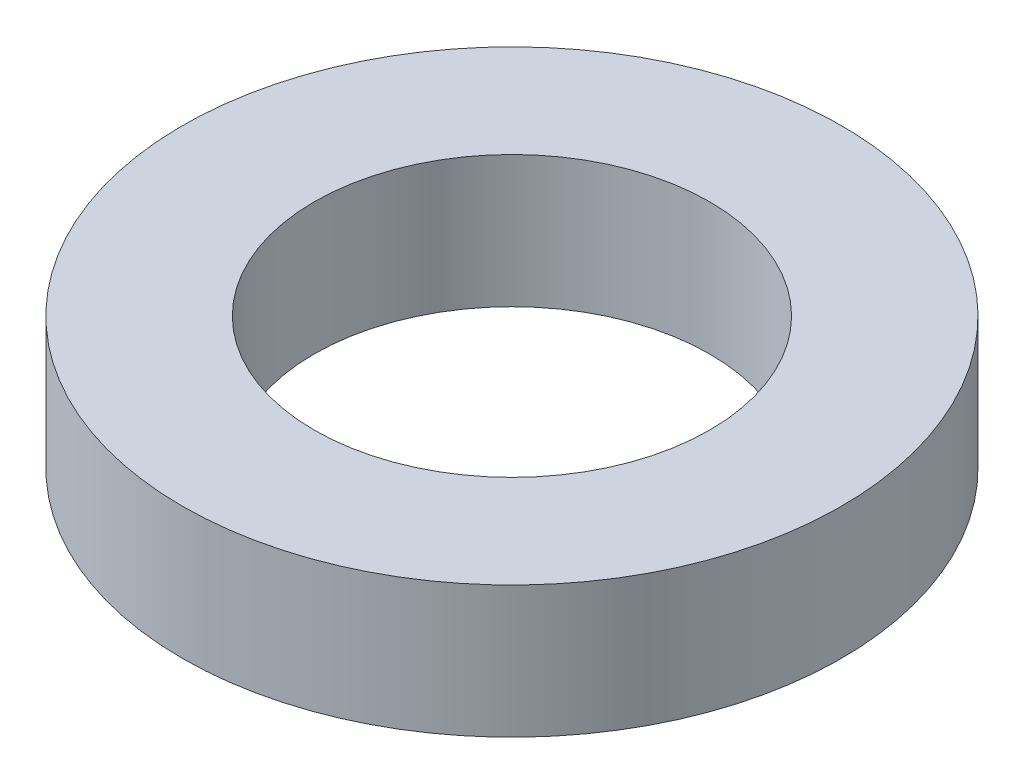
ISO-10303-21;
HEADER;
FILE_DESCRIPTION(('STEP AP214'),'2;1');
FILE_NAME('part.step','',(''),(''),'','','');
FILE_SCHEMA(('AUTOMOTIVE_DESIGN { 1 0 10303 214 1 1 1 1 }'));
ENDSEC;
DATA;
#1=APPLICATION_CONTEXT('core data for automotive mechanical design processes');
#2=APPLICATION_PROTOCOL_DEFINITION('international standard','automotive_design',2000,#1);
#3=PRODUCT_CONTEXT('',#1,'mechanical');
#4=PRODUCT('Part','Part','',(#3));
#5=PRODUCT_RELATED_PRODUCT_CATEGORY('part','',(#4));
#6=PRODUCT_DEFINITION_FORMATION('','',#4);
#7=PRODUCT_DEFINITION_CONTEXT('part definition',#1,'design');
#8=PRODUCT_DEFINITION('design','',#6,#7);
#9=PRODUCT_DEFINITION_SHAPE('','',#8);
#10=(LENGTH_UNIT() NAMED_UNIT(*) SI_UNIT(.MILLI.,.METRE.));
#11=(NAMED_UNIT(*) PLANE_ANGLE_UNIT() SI_UNIT($,.RADIAN.));
#12=(NAMED_UNIT(*) SI_UNIT($,.STERADIAN.) SOLID_ANGLE_UNIT());
#13=UNCERTAINTY_MEASURE_WITH_UNIT(LENGTH_MEASURE(1.E-05),#10,'distance_accuracy_value','');
#14=(GEOMETRIC_REPRESENTATION_CONTEXT(3) GLOBAL_UNCERTAINTY_ASSIGNED_CONTEXT((#13)) GLOBAL_UNIT_ASSIGNED_CONTEXT((#10,
#11,#12)) REPRESENTATION_CONTEXT('',''));
#15=CARTESIAN_POINT('',(0.,0.,0.));
#16=DIRECTION('',(0.,0.,1.));
#17=DIRECTION('',(1.,0.,0.));
#18=AXIS2_PLACEMENT_3D('',#15,#16,#17);
#19=CARTESIAN_POINT('',(0.,1.,0.));
#20=DIRECTION('',(0.,1.,0.));
#21=DIRECTION('',(0.,0.,1.));
#22=AXIS2_PLACEMENT_3D('',#19,#20,#21);
#23=PLANE('',#22);
#24=CARTESIAN_POINT('',(0.,1.,0.));
#25=DIRECTION('',(0.,1.,0.));
#26=DIRECTION('',(0.,0.,1.));
#27=AXIS2_PLACEMENT_3D('',#24,#25,#26);
#28=CIRCLE('',#27,2.5);
#29=CARTESIAN_POINT('',(0.,1.,2.5));
#30=VERTEX_POINT('',#29);
#31=EDGE_CURVE('E10',#30,#30,#28,.T.);
#32=ORIENTED_EDGE('',*,*,#31,.T.);
#33=EDGE_LOOP('',(#32));
#34=FACE_BOUND('',#33,.T.);
#35=CARTESIAN_POINT('',(0.,1.,0.));
#36=DIRECTION('',(0.,1.,0.));
#37=DIRECTION('',(0.,0.,1.));
#38=AXIS2_PLACEMENT_3D('',#35,#36,#37);
#39=CIRCLE('',#38,1.5);
#40=CARTESIAN_POINT('',(0.,1.,1.5));
#41=VERTEX_POINT('',#40);
#42=EDGE_CURVE('E42',#41,#41,#39,.T.);
#43=ORIENTED_EDGE('',*,*,#42,.F.);
#44=EDGE_LOOP('',(#43));
#45=FACE_BOUND('',#44,.T.);
#46=ADVANCED_FACE('F31',(#34,#45),#23,.T.);
#47=CARTESIAN_POINT('',(0.,0.,0.));
#48=DIRECTION('',(0.,1.,0.));
#49=DIRECTION('',(0.,0.,1.));
#50=AXIS2_PLACEMENT_3D('',#47,#48,#49);
#51=PLANE('',#50);
#52=CARTESIAN_POINT('',(0.,0.,0.));
#53=DIRECTION('',(0.,1.,0.));
#54=DIRECTION('',(0.,0.,1.));
#55=AXIS2_PLACEMENT_3D('',#52,#53,#54);
#56=CIRCLE('',#55,2.5);
#57=CARTESIAN_POINT('',(0.,0.,2.5));
#58=VERTEX_POINT('',#57);
#59=EDGE_CURVE('E35',#58,#58,#56,.T.);
#60=ORIENTED_EDGE('',*,*,#59,.F.);
#61=EDGE_LOOP('',(#60));
#62=FACE_BOUND('',#61,.T.);
#63=CARTESIAN_POINT('',(0.,0.,0.));
#64=DIRECTION('',(0.,1.,0.));
#65=DIRECTION('',(0.,0.,1.));
#66=AXIS2_PLACEMENT_3D('',#63,#64,#65);
#67=CIRCLE('',#66,1.5);
#68=CARTESIAN_POINT('',(0.,0.,1.5));
#69=VERTEX_POINT('',#68);
#70=EDGE_CURVE('E44',#69,#69,#67,.T.);
#71=ORIENTED_EDGE('',*,*,#70,.T.);
#72=EDGE_LOOP('',(#71));
#73=FACE_BOUND('',#72,.T.);
#74=ADVANCED_FACE('F54',(#62,#73),#51,.F.);
#75=CARTESIAN_POINT('',(0.,1.,0.));
#76=DIRECTION('',(0.,-1.,0.));
#77=DIRECTION('',(0.,0.,-1.));
#78=AXIS2_PLACEMENT_3D('',#75,#76,#77);
#79=CYLINDRICAL_SURFACE('',#78,2.5);
#80=ORIENTED_EDGE('',*,*,#31,.F.);
#81=EDGE_LOOP('',(#80));
#82=FACE_BOUND('',#81,.T.);
#83=ORIENTED_EDGE('',*,*,#59,.T.);
#84=EDGE_LOOP('',(#83));
#85=FACE_BOUND('',#84,.T.);
#86=ADVANCED_FACE('F33',(#82,#85),#79,.T.);
#87=CARTESIAN_POINT('',(0.,1.,0.));
#88=DIRECTION('',(0.,-1.,0.));
#89=DIRECTION('',(0.,0.,-1.));
#90=AXIS2_PLACEMENT_3D('',#87,#88,#89);
#91=CYLINDRICAL_SURFACE('',#90,1.5);
#92=ORIENTED_EDGE('',*,*,#42,.T.);
#93=EDGE_LOOP('',(#92));
#94=FACE_BOUND('',#93,.T.);
#95=ORIENTED_EDGE('',*,*,#70,.F.);
#96=EDGE_LOOP('',(#95));
#97=FACE_BOUND('',#96,.T.);
#98=ADVANCED_FACE('F50',(#94,#97),#91,.F.);
#99=CLOSED_SHELL('',(#46,#74,#86,#98));
#100=MANIFOLD_SOLID_BREP('B2',#99);
#101=ADVANCED_BREP_SHAPE_REPRESENTATION('',(#18,#100),#14);
#102=SHAPE_DEFINITION_REPRESENTATION(#9,#101);
ENDSEC;
END-ISO-10303-21;
